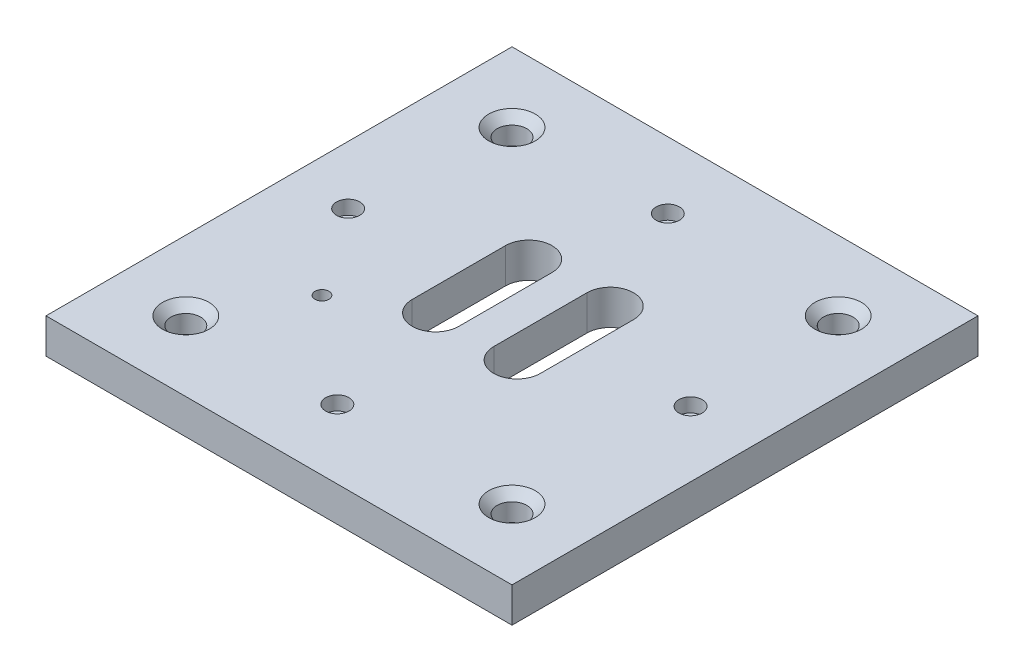
ISO-10303-21;
HEADER;
FILE_DESCRIPTION(('STEP AP214'),'2;1');
FILE_NAME('part.step','',(''),(''),'','','');
FILE_SCHEMA(('AUTOMOTIVE_DESIGN { 1 0 10303 214 1 1 1 1 }'));
ENDSEC;
DATA;
#1=APPLICATION_CONTEXT('core data for automotive mechanical design processes');
#2=APPLICATION_PROTOCOL_DEFINITION('international standard','automotive_design',2000,#1);
#3=PRODUCT_CONTEXT('',#1,'mechanical');
#4=PRODUCT('Part','Part','',(#3));
#5=PRODUCT_RELATED_PRODUCT_CATEGORY('part','',(#4));
#6=PRODUCT_DEFINITION_FORMATION('','',#4);
#7=PRODUCT_DEFINITION_CONTEXT('part definition',#1,'design');
#8=PRODUCT_DEFINITION('design','',#6,#7);
#9=PRODUCT_DEFINITION_SHAPE('','',#8);
#10=(LENGTH_UNIT() NAMED_UNIT(*) SI_UNIT(.MILLI.,.METRE.));
#11=(NAMED_UNIT(*) PLANE_ANGLE_UNIT() SI_UNIT($,.RADIAN.));
#12=(NAMED_UNIT(*) SI_UNIT($,.STERADIAN.) SOLID_ANGLE_UNIT());
#13=UNCERTAINTY_MEASURE_WITH_UNIT(LENGTH_MEASURE(1.E-05),#10,'distance_accuracy_value','');
#14=(GEOMETRIC_REPRESENTATION_CONTEXT(3) GLOBAL_UNCERTAINTY_ASSIGNED_CONTEXT((#13)) GLOBAL_UNIT_ASSIGNED_CONTEXT((#10,
#11,#12)) REPRESENTATION_CONTEXT('',''));
#15=CARTESIAN_POINT('',(0.,0.,0.));
#16=DIRECTION('',(0.,0.,1.));
#17=DIRECTION('',(1.,0.,0.));
#18=AXIS2_PLACEMENT_3D('',#15,#16,#17);
#19=CARTESIAN_POINT('',(200.,30.,200.));
#20=DIRECTION('',(-1.,0.,0.));
#21=DIRECTION('',(0.,0.,1.));
#22=AXIS2_PLACEMENT_3D('',#19,#20,#21);
#23=PLANE('',#22);
#24=DIRECTION('',(0.,0.,-1.));
#25=VECTOR('',#24,1.);
#26=CARTESIAN_POINT('',(200.,0.,200.));
#27=LINE('',#26,#25);
#28=CARTESIAN_POINT('',(200.,0.,200.));
#29=VERTEX_POINT('',#28);
#30=CARTESIAN_POINT('',(200.,0.,-200.));
#31=VERTEX_POINT('',#30);
#32=EDGE_CURVE('E295',#29,#31,#27,.T.);
#33=ORIENTED_EDGE('',*,*,#32,.T.);
#34=DIRECTION('',(0.,-1.,0.));
#35=VECTOR('',#34,1.);
#36=CARTESIAN_POINT('',(200.,30.,-200.));
#37=LINE('',#36,#35);
#38=CARTESIAN_POINT('',(200.,30.,-200.));
#39=VERTEX_POINT('',#38);
#40=EDGE_CURVE('E11',#39,#31,#37,.T.);
#41=ORIENTED_EDGE('',*,*,#40,.F.);
#42=DIRECTION('',(0.,0.,-1.));
#43=VECTOR('',#42,1.);
#44=CARTESIAN_POINT('',(200.,30.,200.));
#45=LINE('',#44,#43);
#46=CARTESIAN_POINT('',(200.,30.,200.));
#47=VERTEX_POINT('',#46);
#48=EDGE_CURVE('E296',#47,#39,#45,.T.);
#49=ORIENTED_EDGE('',*,*,#48,.F.);
#50=DIRECTION('',(0.,-1.,0.));
#51=VECTOR('',#50,1.);
#52=CARTESIAN_POINT('',(200.,30.,200.));
#53=LINE('',#52,#51);
#54=EDGE_CURVE('E306',#47,#29,#53,.T.);
#55=ORIENTED_EDGE('',*,*,#54,.T.);
#56=EDGE_LOOP('',(#33,#41,#49,#55));
#57=FACE_BOUND('',#56,.T.);
#58=ADVANCED_FACE('F35',(#57),#23,.F.);
#59=CARTESIAN_POINT('',(-200.,30.,-200.));
#60=DIRECTION('',(0.,0.,1.));
#61=DIRECTION('',(1.,0.,0.));
#62=AXIS2_PLACEMENT_3D('',#59,#60,#61);
#63=PLANE('',#62);
#64=DIRECTION('',(-1.,0.,0.));
#65=VECTOR('',#64,1.);
#66=CARTESIAN_POINT('',(-200.,0.,-200.));
#67=LINE('',#66,#65);
#68=CARTESIAN_POINT('',(-200.,0.,-200.));
#69=VERTEX_POINT('',#68);
#70=EDGE_CURVE('E309',#31,#69,#67,.T.);
#71=ORIENTED_EDGE('',*,*,#70,.T.);
#72=DIRECTION('',(0.,-1.,0.));
#73=VECTOR('',#72,1.);
#74=CARTESIAN_POINT('',(-200.,30.,-200.));
#75=LINE('',#74,#73);
#76=CARTESIAN_POINT('',(-200.,30.,-200.));
#77=VERTEX_POINT('',#76);
#78=EDGE_CURVE('E42',#77,#69,#75,.T.);
#79=ORIENTED_EDGE('',*,*,#78,.F.);
#80=DIRECTION('',(-1.,0.,0.));
#81=VECTOR('',#80,1.);
#82=CARTESIAN_POINT('',(-200.,30.,-200.));
#83=LINE('',#82,#81);
#84=EDGE_CURVE('E299',#39,#77,#83,.T.);
#85=ORIENTED_EDGE('',*,*,#84,.F.);
#86=ORIENTED_EDGE('',*,*,#40,.T.);
#87=EDGE_LOOP('',(#71,#79,#85,#86));
#88=FACE_BOUND('',#87,.T.);
#89=ADVANCED_FACE('F339',(#88),#63,.F.);
#90=CARTESIAN_POINT('',(-200.,30.,200.));
#91=DIRECTION('',(1.,0.,0.));
#92=DIRECTION('',(0.,0.,-1.));
#93=AXIS2_PLACEMENT_3D('',#90,#91,#92);
#94=PLANE('',#93);
#95=DIRECTION('',(0.,0.,1.));
#96=VECTOR('',#95,1.);
#97=CARTESIAN_POINT('',(-200.,0.,200.));
#98=LINE('',#97,#96);
#99=CARTESIAN_POINT('',(-200.,0.,200.));
#100=VERTEX_POINT('',#99);
#101=EDGE_CURVE('E311',#69,#100,#98,.T.);
#102=ORIENTED_EDGE('',*,*,#101,.T.);
#103=DIRECTION('',(0.,-1.,0.));
#104=VECTOR('',#103,1.);
#105=CARTESIAN_POINT('',(-200.,30.,200.));
#106=LINE('',#105,#104);
#107=CARTESIAN_POINT('',(-200.,30.,200.));
#108=VERTEX_POINT('',#107);
#109=EDGE_CURVE('E316',#108,#100,#106,.T.);
#110=ORIENTED_EDGE('',*,*,#109,.F.);
#111=DIRECTION('',(0.,0.,1.));
#112=VECTOR('',#111,1.);
#113=CARTESIAN_POINT('',(-200.,30.,200.));
#114=LINE('',#113,#112);
#115=EDGE_CURVE('E302',#77,#108,#114,.T.);
#116=ORIENTED_EDGE('',*,*,#115,.F.);
#117=ORIENTED_EDGE('',*,*,#78,.T.);
#118=EDGE_LOOP('',(#102,#110,#116,#117));
#119=FACE_BOUND('',#118,.T.);
#120=ADVANCED_FACE('F323',(#119),#94,.F.);
#121=CARTESIAN_POINT('',(-200.,30.,200.));
#122=DIRECTION('',(0.,0.,-1.));
#123=DIRECTION('',(-1.,0.,0.));
#124=AXIS2_PLACEMENT_3D('',#121,#122,#123);
#125=PLANE('',#124);
#126=DIRECTION('',(1.,0.,0.));
#127=VECTOR('',#126,1.);
#128=CARTESIAN_POINT('',(-200.,0.,200.));
#129=LINE('',#128,#127);
#130=EDGE_CURVE('E300',#100,#29,#129,.T.);
#131=ORIENTED_EDGE('',*,*,#130,.T.);
#132=ORIENTED_EDGE('',*,*,#54,.F.);
#133=DIRECTION('',(1.,0.,0.));
#134=VECTOR('',#133,1.);
#135=CARTESIAN_POINT('',(-200.,30.,200.));
#136=LINE('',#135,#134);
#137=EDGE_CURVE('E304',#108,#47,#136,.T.);
#138=ORIENTED_EDGE('',*,*,#137,.F.);
#139=ORIENTED_EDGE('',*,*,#109,.T.);
#140=EDGE_LOOP('',(#131,#132,#138,#139));
#141=FACE_BOUND('',#140,.T.);
#142=ADVANCED_FACE('F332',(#141),#125,.F.);
#143=CARTESIAN_POINT('',(0.,30.,0.));
#144=DIRECTION('',(0.,-1.,0.));
#145=DIRECTION('',(0.,0.,-1.));
#146=AXIS2_PLACEMENT_3D('',#143,#144,#145);
#147=PLANE('',#146);
#148=CARTESIAN_POINT('',(-96.8218511033105,30.,66.2899605565278));
#149=DIRECTION('',(0.,1.,0.));
#150=DIRECTION('',(0.,0.,1.));
#151=AXIS2_PLACEMENT_3D('',#148,#149,#150);
#152=CIRCLE('',#151,5.99999999999999);
#153=CARTESIAN_POINT('',(-96.8218511033105,30.,72.2899605565278));
#154=VERTEX_POINT('',#153);
#155=EDGE_CURVE('E135',#154,#154,#152,.T.);
#156=ORIENTED_EDGE('',*,*,#155,.F.);
#157=EDGE_LOOP('',(#156));
#158=FACE_BOUND('',#157,.T.);
#159=CARTESIAN_POINT('',(-9.13597394705512,30.,140.778837954315));
#160=DIRECTION('',(0.,1.,0.));
#161=DIRECTION('',(0.,0.,1.));
#162=AXIS2_PLACEMENT_3D('',#159,#160,#161);
#163=CIRCLE('',#162,10.);
#164=CARTESIAN_POINT('',(-9.13597394705512,30.,150.778837954315));
#165=VERTEX_POINT('',#164);
#166=EDGE_CURVE('E134',#165,#165,#163,.T.);
#167=ORIENTED_EDGE('',*,*,#166,.F.);
#168=EDGE_LOOP('',(#167));
#169=FACE_BOUND('',#168,.T.);
#170=CARTESIAN_POINT('',(-149.993262569964,30.,-9.35211061793355));
#171=DIRECTION('',(0.,1.,0.));
#172=DIRECTION('',(0.,0.,1.));
#173=AXIS2_PLACEMENT_3D('',#170,#171,#172);
#174=CIRCLE('',#173,10.);
#175=CARTESIAN_POINT('',(-149.993262569964,30.,0.647889382066454));
#176=VERTEX_POINT('',#175);
#177=EDGE_CURVE('E151',#176,#176,#174,.T.);
#178=ORIENTED_EDGE('',*,*,#177,.F.);
#179=EDGE_LOOP('',(#178));
#180=FACE_BOUND('',#179,.T.);
#181=CARTESIAN_POINT('',(-9.13597394705512,30.,-142.861352041251));
#182=DIRECTION('',(0.,1.,0.));
#183=DIRECTION('',(0.,0.,1.));
#184=AXIS2_PLACEMENT_3D('',#181,#182,#183);
#185=CIRCLE('',#184,10.);
#186=CARTESIAN_POINT('',(-9.13597394705512,30.,-132.861352041251));
#187=VERTEX_POINT('',#186);
#188=EDGE_CURVE('E163',#187,#187,#185,.T.);
#189=ORIENTED_EDGE('',*,*,#188,.F.);
#190=EDGE_LOOP('',(#189));
#191=FACE_BOUND('',#190,.T.);
#192=CARTESIAN_POINT('',(143.896335676409,30.,-9.35211061793355));
#193=DIRECTION('',(0.,1.,0.));
#194=DIRECTION('',(0.,0.,1.));
#195=AXIS2_PLACEMENT_3D('',#192,#193,#194);
#196=CIRCLE('',#195,10.);
#197=CARTESIAN_POINT('',(143.896335676409,30.,0.647889382066454));
#198=VERTEX_POINT('',#197);
#199=EDGE_CURVE('E175',#198,#198,#196,.T.);
#200=ORIENTED_EDGE('',*,*,#199,.F.);
#201=EDGE_LOOP('',(#200));
#202=FACE_BOUND('',#201,.T.);
#203=CARTESIAN_POINT('',(-35.,30.,30.6478893820665));
#204=DIRECTION('',(0.,1.,0.));
#205=DIRECTION('',(0.,0.,1.));
#206=AXIS2_PLACEMENT_3D('',#203,#204,#205);
#207=CIRCLE('',#206,20.);
#208=CARTESIAN_POINT('',(-55.,30.,30.6478893820665));
#209=VERTEX_POINT('',#208);
#210=CARTESIAN_POINT('',(-15.,30.,30.6478893820665));
#211=VERTEX_POINT('',#210);
#212=EDGE_CURVE('E202',#209,#211,#207,.T.);
#213=ORIENTED_EDGE('',*,*,#212,.F.);
#214=DIRECTION('',(0.,0.,1.));
#215=VECTOR('',#214,1.);
#216=CARTESIAN_POINT('',(-55.,30.,0.));
#217=LINE('',#216,#215);
#218=CARTESIAN_POINT('',(-55.,30.,-49.3521106179335));
#219=VERTEX_POINT('',#218);
#220=EDGE_CURVE('E49',#219,#209,#217,.T.);
#221=ORIENTED_EDGE('',*,*,#220,.F.);
#222=CARTESIAN_POINT('',(-35.,30.,-49.3521106179335));
#223=DIRECTION('',(0.,1.,0.));
#224=DIRECTION('',(0.,0.,1.));
#225=AXIS2_PLACEMENT_3D('',#222,#223,#224);
#226=CIRCLE('',#225,20.);
#227=CARTESIAN_POINT('',(-15.,30.,-49.3521106179335));
#228=VERTEX_POINT('',#227);
#229=EDGE_CURVE('E191',#228,#219,#226,.T.);
#230=ORIENTED_EDGE('',*,*,#229,.F.);
#231=DIRECTION('',(0.,0.,1.));
#232=VECTOR('',#231,1.);
#233=CARTESIAN_POINT('',(-15.,30.,0.));
#234=LINE('',#233,#232);
#235=EDGE_CURVE('E206',#228,#211,#234,.T.);
#236=ORIENTED_EDGE('',*,*,#235,.T.);
#237=EDGE_LOOP('',(#213,#221,#230,#236));
#238=FACE_BOUND('',#237,.T.);
#239=CARTESIAN_POINT('',(35.,30.,30.6478893820665));
#240=DIRECTION('',(0.,1.,0.));
#241=DIRECTION('',(0.,0.,1.));
#242=AXIS2_PLACEMENT_3D('',#239,#240,#241);
#243=CIRCLE('',#242,20.);
#244=CARTESIAN_POINT('',(15.,30.,30.6478893820665));
#245=VERTEX_POINT('',#244);
#246=CARTESIAN_POINT('',(55.,30.,30.6478893820664));
#247=VERTEX_POINT('',#246);
#248=EDGE_CURVE('E234',#245,#247,#243,.T.);
#249=ORIENTED_EDGE('',*,*,#248,.F.);
#250=DIRECTION('',(0.,0.,1.));
#251=VECTOR('',#250,1.);
#252=CARTESIAN_POINT('',(15.,30.,0.));
#253=LINE('',#252,#251);
#254=CARTESIAN_POINT('',(15.,30.,-49.3521106179335));
#255=VERTEX_POINT('',#254);
#256=EDGE_CURVE('E57',#255,#245,#253,.T.);
#257=ORIENTED_EDGE('',*,*,#256,.F.);
#258=CARTESIAN_POINT('',(35.,30.,-49.3521106179335));
#259=DIRECTION('',(0.,1.,0.));
#260=DIRECTION('',(0.,0.,1.));
#261=AXIS2_PLACEMENT_3D('',#258,#259,#260);
#262=CIRCLE('',#261,20.);
#263=CARTESIAN_POINT('',(54.9999999999999,30.,-49.3521106179336));
#264=VERTEX_POINT('',#263);
#265=EDGE_CURVE('E223',#264,#255,#262,.T.);
#266=ORIENTED_EDGE('',*,*,#265,.F.);
#267=DIRECTION('',(0.,0.,1.));
#268=VECTOR('',#267,1.);
#269=CARTESIAN_POINT('',(55.,30.,0.));
#270=LINE('',#269,#268);
#271=EDGE_CURVE('E237',#264,#247,#270,.T.);
#272=ORIENTED_EDGE('',*,*,#271,.T.);
#273=EDGE_LOOP('',(#249,#257,#266,#272));
#274=FACE_BOUND('',#273,.T.);
#275=CARTESIAN_POINT('',(-140.,30.,140.));
#276=DIRECTION('',(0.,1.,0.));
#277=DIRECTION('',(0.,0.,1.));
#278=AXIS2_PLACEMENT_3D('',#275,#276,#277);
#279=CIRCLE('',#278,20.);
#280=CARTESIAN_POINT('',(-140.,30.,160.));
#281=VERTEX_POINT('',#280);
#282=EDGE_CURVE('E250',#281,#281,#279,.T.);
#283=ORIENTED_EDGE('',*,*,#282,.F.);
#284=EDGE_LOOP('',(#283));
#285=FACE_BOUND('',#284,.T.);
#286=CARTESIAN_POINT('',(-140.,30.,-140.));
#287=DIRECTION('',(0.,1.,0.));
#288=DIRECTION('',(0.,0.,1.));
#289=AXIS2_PLACEMENT_3D('',#286,#287,#288);
#290=CIRCLE('',#289,20.);
#291=CARTESIAN_POINT('',(-140.,30.,-120.));
#292=VERTEX_POINT('',#291);
#293=EDGE_CURVE('E262',#292,#292,#290,.T.);
#294=ORIENTED_EDGE('',*,*,#293,.F.);
#295=EDGE_LOOP('',(#294));
#296=FACE_BOUND('',#295,.T.);
#297=CARTESIAN_POINT('',(140.,30.,140.));
#298=DIRECTION('',(0.,1.,0.));
#299=DIRECTION('',(0.,0.,1.));
#300=AXIS2_PLACEMENT_3D('',#297,#298,#299);
#301=CIRCLE('',#300,20.);
#302=CARTESIAN_POINT('',(140.,30.,160.));
#303=VERTEX_POINT('',#302);
#304=EDGE_CURVE('E274',#303,#303,#301,.T.);
#305=ORIENTED_EDGE('',*,*,#304,.F.);
#306=EDGE_LOOP('',(#305));
#307=FACE_BOUND('',#306,.T.);
#308=CARTESIAN_POINT('',(140.,30.,-140.));
#309=DIRECTION('',(0.,1.,0.));
#310=DIRECTION('',(0.,0.,1.));
#311=AXIS2_PLACEMENT_3D('',#308,#309,#310);
#312=CIRCLE('',#311,20.);
#313=CARTESIAN_POINT('',(140.,30.,-120.));
#314=VERTEX_POINT('',#313);
#315=EDGE_CURVE('E286',#314,#314,#312,.T.);
#316=ORIENTED_EDGE('',*,*,#315,.F.);
#317=EDGE_LOOP('',(#316));
#318=FACE_BOUND('',#317,.T.);
#319=ORIENTED_EDGE('',*,*,#48,.T.);
#320=ORIENTED_EDGE('',*,*,#84,.T.);
#321=ORIENTED_EDGE('',*,*,#115,.T.);
#322=ORIENTED_EDGE('',*,*,#137,.T.);
#323=EDGE_LOOP('',(#319,#320,#321,#322));
#324=FACE_BOUND('',#323,.T.);
#325=ADVANCED_FACE('F338',(#158,#169,#180,#191,#202,#238,#274,#285,#296,#307,#318,#324),#147,.F.);
#326=CARTESIAN_POINT('',(0.,0.,0.));
#327=DIRECTION('',(0.,-1.,0.));
#328=DIRECTION('',(0.,0.,-1.));
#329=AXIS2_PLACEMENT_3D('',#326,#327,#328);
#330=PLANE('',#329);
#331=CARTESIAN_POINT('',(-9.13597394705512,0.,140.778837954315));
#332=DIRECTION('',(0.,1.,0.));
#333=DIRECTION('',(0.,0.,1.));
#334=AXIS2_PLACEMENT_3D('',#331,#332,#333);
#335=CIRCLE('',#334,6.49999999999999);
#336=CARTESIAN_POINT('',(-9.13597394705512,0.,147.278837954315));
#337=VERTEX_POINT('',#336);
#338=EDGE_CURVE('E148',#337,#337,#335,.T.);
#339=ORIENTED_EDGE('',*,*,#338,.T.);
#340=EDGE_LOOP('',(#339));
#341=FACE_BOUND('',#340,.T.);
#342=CARTESIAN_POINT('',(-149.993262569964,0.,-9.35211061793355));
#343=DIRECTION('',(0.,1.,0.));
#344=DIRECTION('',(0.,0.,1.));
#345=AXIS2_PLACEMENT_3D('',#342,#343,#344);
#346=CIRCLE('',#345,6.50000000000001);
#347=CARTESIAN_POINT('',(-149.993262569964,0.,-2.85211061793355));
#348=VERTEX_POINT('',#347);
#349=EDGE_CURVE('E160',#348,#348,#346,.T.);
#350=ORIENTED_EDGE('',*,*,#349,.T.);
#351=EDGE_LOOP('',(#350));
#352=FACE_BOUND('',#351,.T.);
#353=CARTESIAN_POINT('',(-9.13597394705512,0.,-142.861352041251));
#354=DIRECTION('',(0.,1.,0.));
#355=DIRECTION('',(0.,0.,1.));
#356=AXIS2_PLACEMENT_3D('',#353,#354,#355);
#357=CIRCLE('',#356,6.49999999999999);
#358=CARTESIAN_POINT('',(-9.13597394705512,0.,-136.361352041251));
#359=VERTEX_POINT('',#358);
#360=EDGE_CURVE('E172',#359,#359,#357,.T.);
#361=ORIENTED_EDGE('',*,*,#360,.T.);
#362=EDGE_LOOP('',(#361));
#363=FACE_BOUND('',#362,.T.);
#364=CARTESIAN_POINT('',(143.896335676409,0.,-9.35211061793355));
#365=DIRECTION('',(0.,1.,0.));
#366=DIRECTION('',(0.,0.,1.));
#367=AXIS2_PLACEMENT_3D('',#364,#365,#366);
#368=CIRCLE('',#367,6.50000000000001);
#369=CARTESIAN_POINT('',(143.896335676409,0.,-2.85211061793355));
#370=VERTEX_POINT('',#369);
#371=EDGE_CURVE('E184',#370,#370,#368,.T.);
#372=ORIENTED_EDGE('',*,*,#371,.T.);
#373=EDGE_LOOP('',(#372));
#374=FACE_BOUND('',#373,.T.);
#375=DIRECTION('',(0.,0.,1.));
#376=VECTOR('',#375,1.);
#377=CARTESIAN_POINT('',(-55.,0.,0.));
#378=LINE('',#377,#376);
#379=CARTESIAN_POINT('',(-55.,0.,-49.3521106179335));
#380=VERTEX_POINT('',#379);
#381=CARTESIAN_POINT('',(-55.,0.,30.6478893820665));
#382=VERTEX_POINT('',#381);
#383=EDGE_CURVE('E187',#380,#382,#378,.T.);
#384=ORIENTED_EDGE('',*,*,#383,.T.);
#385=CARTESIAN_POINT('',(-35.,0.,30.6478893820665));
#386=DIRECTION('',(0.,1.,0.));
#387=DIRECTION('',(0.,0.,1.));
#388=AXIS2_PLACEMENT_3D('',#385,#386,#387);
#389=CIRCLE('',#388,20.);
#390=CARTESIAN_POINT('',(-15.,0.,30.6478893820665));
#391=VERTEX_POINT('',#390);
#392=EDGE_CURVE('E190',#382,#391,#389,.T.);
#393=ORIENTED_EDGE('',*,*,#392,.T.);
#394=DIRECTION('',(0.,0.,1.));
#395=VECTOR('',#394,1.);
#396=CARTESIAN_POINT('',(-15.,0.,0.));
#397=LINE('',#396,#395);
#398=CARTESIAN_POINT('',(-15.,0.,-49.3521106179335));
#399=VERTEX_POINT('',#398);
#400=EDGE_CURVE('E194',#399,#391,#397,.T.);
#401=ORIENTED_EDGE('',*,*,#400,.F.);
#402=CARTESIAN_POINT('',(-35.,0.,-49.3521106179335));
#403=DIRECTION('',(0.,1.,0.));
#404=DIRECTION('',(0.,0.,1.));
#405=AXIS2_PLACEMENT_3D('',#402,#403,#404);
#406=CIRCLE('',#405,20.);
#407=EDGE_CURVE('E197',#399,#380,#406,.T.);
#408=ORIENTED_EDGE('',*,*,#407,.T.);
#409=EDGE_LOOP('',(#384,#393,#401,#408));
#410=FACE_BOUND('',#409,.T.);
#411=DIRECTION('',(0.,0.,1.));
#412=VECTOR('',#411,1.);
#413=CARTESIAN_POINT('',(15.,0.,0.));
#414=LINE('',#413,#412);
#415=CARTESIAN_POINT('',(15.,0.,-49.3521106179335));
#416=VERTEX_POINT('',#415);
#417=CARTESIAN_POINT('',(15.,0.,30.6478893820665));
#418=VERTEX_POINT('',#417);
#419=EDGE_CURVE('E219',#416,#418,#414,.T.);
#420=ORIENTED_EDGE('',*,*,#419,.T.);
#421=CARTESIAN_POINT('',(35.,0.,30.6478893820665));
#422=DIRECTION('',(0.,1.,0.));
#423=DIRECTION('',(0.,0.,1.));
#424=AXIS2_PLACEMENT_3D('',#421,#422,#423);
#425=CIRCLE('',#424,20.);
#426=CARTESIAN_POINT('',(55.,0.,30.6478893820664));
#427=VERTEX_POINT('',#426);
#428=EDGE_CURVE('E222',#418,#427,#425,.T.);
#429=ORIENTED_EDGE('',*,*,#428,.T.);
#430=DIRECTION('',(0.,0.,1.));
#431=VECTOR('',#430,1.);
#432=CARTESIAN_POINT('',(55.,0.,0.));
#433=LINE('',#432,#431);
#434=CARTESIAN_POINT('',(54.9999999999999,0.,-49.3521106179336));
#435=VERTEX_POINT('',#434);
#436=EDGE_CURVE('E226',#435,#427,#433,.T.);
#437=ORIENTED_EDGE('',*,*,#436,.F.);
#438=CARTESIAN_POINT('',(35.,0.,-49.3521106179335));
#439=DIRECTION('',(0.,1.,0.));
#440=DIRECTION('',(0.,0.,1.));
#441=AXIS2_PLACEMENT_3D('',#438,#439,#440);
#442=CIRCLE('',#441,20.);
#443=EDGE_CURVE('E229',#435,#416,#442,.T.);
#444=ORIENTED_EDGE('',*,*,#443,.T.);
#445=EDGE_LOOP('',(#420,#429,#437,#444));
#446=FACE_BOUND('',#445,.T.);
#447=CARTESIAN_POINT('',(-140.,0.,140.));
#448=DIRECTION('',(0.,1.,0.));
#449=DIRECTION('',(0.,0.,1.));
#450=AXIS2_PLACEMENT_3D('',#447,#448,#449);
#451=CIRCLE('',#450,20.);
#452=CARTESIAN_POINT('',(-140.,0.,160.));
#453=VERTEX_POINT('',#452);
#454=EDGE_CURVE('E213',#453,#453,#451,.T.);
#455=ORIENTED_EDGE('',*,*,#454,.T.);
#456=EDGE_LOOP('',(#455));
#457=FACE_BOUND('',#456,.T.);
#458=CARTESIAN_POINT('',(-140.,0.,-140.));
#459=DIRECTION('',(0.,1.,0.));
#460=DIRECTION('',(0.,0.,1.));
#461=AXIS2_PLACEMENT_3D('',#458,#459,#460);
#462=CIRCLE('',#461,20.);
#463=CARTESIAN_POINT('',(-140.,0.,-120.));
#464=VERTEX_POINT('',#463);
#465=EDGE_CURVE('E259',#464,#464,#462,.T.);
#466=ORIENTED_EDGE('',*,*,#465,.T.);
#467=EDGE_LOOP('',(#466));
#468=FACE_BOUND('',#467,.T.);
#469=CARTESIAN_POINT('',(140.,0.,140.));
#470=DIRECTION('',(0.,1.,0.));
#471=DIRECTION('',(0.,0.,1.));
#472=AXIS2_PLACEMENT_3D('',#469,#470,#471);
#473=CIRCLE('',#472,20.);
#474=CARTESIAN_POINT('',(140.,0.,160.));
#475=VERTEX_POINT('',#474);
#476=EDGE_CURVE('E271',#475,#475,#473,.T.);
#477=ORIENTED_EDGE('',*,*,#476,.T.);
#478=EDGE_LOOP('',(#477));
#479=FACE_BOUND('',#478,.T.);
#480=CARTESIAN_POINT('',(140.,0.,-140.));
#481=DIRECTION('',(0.,1.,0.));
#482=DIRECTION('',(0.,0.,1.));
#483=AXIS2_PLACEMENT_3D('',#480,#481,#482);
#484=CIRCLE('',#483,20.);
#485=CARTESIAN_POINT('',(140.,0.,-120.));
#486=VERTEX_POINT('',#485);
#487=EDGE_CURVE('E283',#486,#486,#484,.T.);
#488=ORIENTED_EDGE('',*,*,#487,.T.);
#489=EDGE_LOOP('',(#488));
#490=FACE_BOUND('',#489,.T.);
#491=ORIENTED_EDGE('',*,*,#32,.F.);
#492=ORIENTED_EDGE('',*,*,#130,.F.);
#493=ORIENTED_EDGE('',*,*,#101,.F.);
#494=ORIENTED_EDGE('',*,*,#70,.F.);
#495=EDGE_LOOP('',(#491,#492,#493,#494));
#496=FACE_BOUND('',#495,.T.);
#497=ADVANCED_FACE('F329',(#341,#352,#363,#374,#410,#446,#457,#468,#479,#490,#496),#330,.T.);
#498=CARTESIAN_POINT('',(140.,7.25,-140.));
#499=DIRECTION('',(0.,-1.,0.));
#500=DIRECTION('',(0.,0.,-1.));
#501=AXIS2_PLACEMENT_3D('',#498,#499,#500);
#502=CONICAL_SURFACE('',#501,12.75,0.785398163397447);
#503=ORIENTED_EDGE('',*,*,#487,.F.);
#504=EDGE_LOOP('',(#503));
#505=FACE_BOUND('',#504,.T.);
#506=CARTESIAN_POINT('',(140.,7.25,-140.));
#507=DIRECTION('',(0.,1.,0.));
#508=DIRECTION('',(0.,0.,1.));
#509=AXIS2_PLACEMENT_3D('',#506,#507,#508);
#510=CIRCLE('',#509,12.75);
#511=CARTESIAN_POINT('',(140.,7.25,-127.25));
#512=VERTEX_POINT('',#511);
#513=EDGE_CURVE('E292',#512,#512,#510,.T.);
#514=ORIENTED_EDGE('',*,*,#513,.T.);
#515=EDGE_LOOP('',(#514));
#516=FACE_BOUND('',#515,.T.);
#517=ADVANCED_FACE('F351',(#505,#516),#502,.F.);
#518=CARTESIAN_POINT('',(140.,30.,-140.));
#519=DIRECTION('',(0.,1.,0.));
#520=DIRECTION('',(0.,0.,1.));
#521=AXIS2_PLACEMENT_3D('',#518,#519,#520);
#522=CYLINDRICAL_SURFACE('',#521,12.75);
#523=ORIENTED_EDGE('',*,*,#513,.F.);
#524=EDGE_LOOP('',(#523));
#525=FACE_BOUND('',#524,.T.);
#526=CARTESIAN_POINT('',(140.,22.75,-140.));
#527=DIRECTION('',(0.,1.,0.));
#528=DIRECTION('',(0.,0.,1.));
#529=AXIS2_PLACEMENT_3D('',#526,#527,#528);
#530=CIRCLE('',#529,12.75);
#531=CARTESIAN_POINT('',(140.,22.75,-127.25));
#532=VERTEX_POINT('',#531);
#533=EDGE_CURVE('E289',#532,#532,#530,.T.);
#534=ORIENTED_EDGE('',*,*,#533,.T.);
#535=EDGE_LOOP('',(#534));
#536=FACE_BOUND('',#535,.T.);
#537=ADVANCED_FACE('F358',(#525,#536),#522,.F.);
#538=CARTESIAN_POINT('',(140.,30.,-140.));
#539=DIRECTION('',(0.,1.,0.));
#540=DIRECTION('',(0.,0.,1.));
#541=AXIS2_PLACEMENT_3D('',#538,#539,#540);
#542=CONICAL_SURFACE('',#541,20.,0.785398163397447);
#543=ORIENTED_EDGE('',*,*,#533,.F.);
#544=EDGE_LOOP('',(#543));
#545=FACE_BOUND('',#544,.T.);
#546=ORIENTED_EDGE('',*,*,#315,.T.);
#547=EDGE_LOOP('',(#546));
#548=FACE_BOUND('',#547,.T.);
#549=ADVANCED_FACE('F362',(#545,#548),#542,.F.);
#550=CARTESIAN_POINT('',(140.,7.25,140.));
#551=DIRECTION('',(0.,-1.,0.));
#552=DIRECTION('',(0.,0.,-1.));
#553=AXIS2_PLACEMENT_3D('',#550,#551,#552);
#554=CONICAL_SURFACE('',#553,12.75,0.785398163397447);
#555=ORIENTED_EDGE('',*,*,#476,.F.);
#556=EDGE_LOOP('',(#555));
#557=FACE_BOUND('',#556,.T.);
#558=CARTESIAN_POINT('',(140.,7.25,140.));
#559=DIRECTION('',(0.,1.,0.));
#560=DIRECTION('',(0.,0.,1.));
#561=AXIS2_PLACEMENT_3D('',#558,#559,#560);
#562=CIRCLE('',#561,12.75);
#563=CARTESIAN_POINT('',(140.,7.25,152.75));
#564=VERTEX_POINT('',#563);
#565=EDGE_CURVE('E280',#564,#564,#562,.T.);
#566=ORIENTED_EDGE('',*,*,#565,.T.);
#567=EDGE_LOOP('',(#566));
#568=FACE_BOUND('',#567,.T.);
#569=ADVANCED_FACE('F366',(#557,#568),#554,.F.);
#570=CARTESIAN_POINT('',(140.,30.,140.));
#571=DIRECTION('',(0.,1.,0.));
#572=DIRECTION('',(0.,0.,1.));
#573=AXIS2_PLACEMENT_3D('',#570,#571,#572);
#574=CYLINDRICAL_SURFACE('',#573,12.75);
#575=ORIENTED_EDGE('',*,*,#565,.F.);
#576=EDGE_LOOP('',(#575));
#577=FACE_BOUND('',#576,.T.);
#578=CARTESIAN_POINT('',(140.,22.75,140.));
#579=DIRECTION('',(0.,1.,0.));
#580=DIRECTION('',(0.,0.,1.));
#581=AXIS2_PLACEMENT_3D('',#578,#579,#580);
#582=CIRCLE('',#581,12.75);
#583=CARTESIAN_POINT('',(140.,22.75,152.75));
#584=VERTEX_POINT('',#583);
#585=EDGE_CURVE('E277',#584,#584,#582,.T.);
#586=ORIENTED_EDGE('',*,*,#585,.T.);
#587=EDGE_LOOP('',(#586));
#588=FACE_BOUND('',#587,.T.);
#589=ADVANCED_FACE('F370',(#577,#588),#574,.F.);
#590=CARTESIAN_POINT('',(140.,30.,140.));
#591=DIRECTION('',(0.,1.,0.));
#592=DIRECTION('',(0.,0.,1.));
#593=AXIS2_PLACEMENT_3D('',#590,#591,#592);
#594=CONICAL_SURFACE('',#593,20.,0.785398163397447);
#595=ORIENTED_EDGE('',*,*,#585,.F.);
#596=EDGE_LOOP('',(#595));
#597=FACE_BOUND('',#596,.T.);
#598=ORIENTED_EDGE('',*,*,#304,.T.);
#599=EDGE_LOOP('',(#598));
#600=FACE_BOUND('',#599,.T.);
#601=ADVANCED_FACE('F374',(#597,#600),#594,.F.);
#602=CARTESIAN_POINT('',(-140.,7.25,-140.));
#603=DIRECTION('',(0.,-1.,0.));
#604=DIRECTION('',(0.,0.,-1.));
#605=AXIS2_PLACEMENT_3D('',#602,#603,#604);
#606=CONICAL_SURFACE('',#605,12.75,0.785398163397448);
#607=ORIENTED_EDGE('',*,*,#465,.F.);
#608=EDGE_LOOP('',(#607));
#609=FACE_BOUND('',#608,.T.);
#610=CARTESIAN_POINT('',(-140.,7.25,-140.));
#611=DIRECTION('',(0.,1.,0.));
#612=DIRECTION('',(0.,0.,1.));
#613=AXIS2_PLACEMENT_3D('',#610,#611,#612);
#614=CIRCLE('',#613,12.75);
#615=CARTESIAN_POINT('',(-140.,7.25,-127.25));
#616=VERTEX_POINT('',#615);
#617=EDGE_CURVE('E268',#616,#616,#614,.T.);
#618=ORIENTED_EDGE('',*,*,#617,.T.);
#619=EDGE_LOOP('',(#618));
#620=FACE_BOUND('',#619,.T.);
#621=ADVANCED_FACE('F378',(#609,#620),#606,.F.);
#622=CARTESIAN_POINT('',(-140.,30.,-140.));
#623=DIRECTION('',(0.,1.,0.));
#624=DIRECTION('',(0.,0.,1.));
#625=AXIS2_PLACEMENT_3D('',#622,#623,#624);
#626=CYLINDRICAL_SURFACE('',#625,12.75);
#627=ORIENTED_EDGE('',*,*,#617,.F.);
#628=EDGE_LOOP('',(#627));
#629=FACE_BOUND('',#628,.T.);
#630=CARTESIAN_POINT('',(-140.,22.75,-140.));
#631=DIRECTION('',(0.,1.,0.));
#632=DIRECTION('',(0.,0.,1.));
#633=AXIS2_PLACEMENT_3D('',#630,#631,#632);
#634=CIRCLE('',#633,12.75);
#635=CARTESIAN_POINT('',(-140.,22.75,-127.25));
#636=VERTEX_POINT('',#635);
#637=EDGE_CURVE('E265',#636,#636,#634,.T.);
#638=ORIENTED_EDGE('',*,*,#637,.T.);
#639=EDGE_LOOP('',(#638));
#640=FACE_BOUND('',#639,.T.);
#641=ADVANCED_FACE('F382',(#629,#640),#626,.F.);
#642=CARTESIAN_POINT('',(-140.,30.,-140.));
#643=DIRECTION('',(0.,1.,0.));
#644=DIRECTION('',(0.,0.,1.));
#645=AXIS2_PLACEMENT_3D('',#642,#643,#644);
#646=CONICAL_SURFACE('',#645,20.,0.785398163397448);
#647=ORIENTED_EDGE('',*,*,#637,.F.);
#648=EDGE_LOOP('',(#647));
#649=FACE_BOUND('',#648,.T.);
#650=ORIENTED_EDGE('',*,*,#293,.T.);
#651=EDGE_LOOP('',(#650));
#652=FACE_BOUND('',#651,.T.);
#653=ADVANCED_FACE('F386',(#649,#652),#646,.F.);
#654=CARTESIAN_POINT('',(-140.,7.25,140.));
#655=DIRECTION('',(0.,-1.,0.));
#656=DIRECTION('',(0.,0.,-1.));
#657=AXIS2_PLACEMENT_3D('',#654,#655,#656);
#658=CONICAL_SURFACE('',#657,12.75,0.785398163397448);
#659=ORIENTED_EDGE('',*,*,#454,.F.);
#660=EDGE_LOOP('',(#659));
#661=FACE_BOUND('',#660,.T.);
#662=CARTESIAN_POINT('',(-140.,7.25,140.));
#663=DIRECTION('',(0.,1.,0.));
#664=DIRECTION('',(0.,0.,1.));
#665=AXIS2_PLACEMENT_3D('',#662,#663,#664);
#666=CIRCLE('',#665,12.75);
#667=CARTESIAN_POINT('',(-140.,7.25,152.75));
#668=VERTEX_POINT('',#667);
#669=EDGE_CURVE('E256',#668,#668,#666,.T.);
#670=ORIENTED_EDGE('',*,*,#669,.T.);
#671=EDGE_LOOP('',(#670));
#672=FACE_BOUND('',#671,.T.);
#673=ADVANCED_FACE('F390',(#661,#672),#658,.F.);
#674=CARTESIAN_POINT('',(-140.,30.,140.));
#675=DIRECTION('',(0.,1.,0.));
#676=DIRECTION('',(0.,0.,1.));
#677=AXIS2_PLACEMENT_3D('',#674,#675,#676);
#678=CYLINDRICAL_SURFACE('',#677,12.75);
#679=ORIENTED_EDGE('',*,*,#669,.F.);
#680=EDGE_LOOP('',(#679));
#681=FACE_BOUND('',#680,.T.);
#682=CARTESIAN_POINT('',(-140.,22.75,140.));
#683=DIRECTION('',(0.,1.,0.));
#684=DIRECTION('',(0.,0.,1.));
#685=AXIS2_PLACEMENT_3D('',#682,#683,#684);
#686=CIRCLE('',#685,12.75);
#687=CARTESIAN_POINT('',(-140.,22.75,152.75));
#688=VERTEX_POINT('',#687);
#689=EDGE_CURVE('E253',#688,#688,#686,.T.);
#690=ORIENTED_EDGE('',*,*,#689,.T.);
#691=EDGE_LOOP('',(#690));
#692=FACE_BOUND('',#691,.T.);
#693=ADVANCED_FACE('F394',(#681,#692),#678,.F.);
#694=CARTESIAN_POINT('',(-140.,30.,140.));
#695=DIRECTION('',(0.,1.,0.));
#696=DIRECTION('',(0.,0.,1.));
#697=AXIS2_PLACEMENT_3D('',#694,#695,#696);
#698=CONICAL_SURFACE('',#697,20.,0.785398163397448);
#699=ORIENTED_EDGE('',*,*,#689,.F.);
#700=EDGE_LOOP('',(#699));
#701=FACE_BOUND('',#700,.T.);
#702=ORIENTED_EDGE('',*,*,#282,.T.);
#703=EDGE_LOOP('',(#702));
#704=FACE_BOUND('',#703,.T.);
#705=ADVANCED_FACE('F398',(#701,#704),#698,.F.);
#706=CARTESIAN_POINT('',(15.,0.,0.));
#707=DIRECTION('',(-1.,0.,0.));
#708=DIRECTION('',(0.,0.,1.));
#709=AXIS2_PLACEMENT_3D('',#706,#707,#708);
#710=PLANE('',#709);
#711=ORIENTED_EDGE('',*,*,#256,.T.);
#712=DIRECTION('',(0.,1.,0.));
#713=VECTOR('',#712,1.);
#714=CARTESIAN_POINT('',(15.,0.,30.6478893820665));
#715=LINE('',#714,#713);
#716=EDGE_CURVE('E232',#418,#245,#715,.T.);
#717=ORIENTED_EDGE('',*,*,#716,.F.);
#718=ORIENTED_EDGE('',*,*,#419,.F.);
#719=DIRECTION('',(0.,1.,0.));
#720=VECTOR('',#719,1.);
#721=CARTESIAN_POINT('',(15.,0.,-49.3521106179335));
#722=LINE('',#721,#720);
#723=EDGE_CURVE('E203',#416,#255,#722,.T.);
#724=ORIENTED_EDGE('',*,*,#723,.T.);
#725=EDGE_LOOP('',(#711,#717,#718,#724));
#726=FACE_BOUND('',#725,.T.);
#727=ADVANCED_FACE('F402',(#726),#710,.F.);
#728=CARTESIAN_POINT('',(35.,0.,-49.3521106179335));
#729=DIRECTION('',(0.,1.,0.));
#730=DIRECTION('',(0.,0.,1.));
#731=AXIS2_PLACEMENT_3D('',#728,#729,#730);
#732=CYLINDRICAL_SURFACE('',#731,20.);
#733=ORIENTED_EDGE('',*,*,#265,.T.);
#734=ORIENTED_EDGE('',*,*,#723,.F.);
#735=ORIENTED_EDGE('',*,*,#443,.F.);
#736=DIRECTION('',(0.,1.,0.));
#737=VECTOR('',#736,1.);
#738=CARTESIAN_POINT('',(54.9999999999999,0.,-49.3521106179336));
#739=LINE('',#738,#737);
#740=EDGE_CURVE('E243',#435,#264,#739,.T.);
#741=ORIENTED_EDGE('',*,*,#740,.T.);
#742=EDGE_LOOP('',(#733,#734,#735,#741));
#743=FACE_BOUND('',#742,.T.);
#744=ADVANCED_FACE('F406',(#743),#732,.F.);
#745=CARTESIAN_POINT('',(55.,0.,0.));
#746=DIRECTION('',(-1.,0.,0.));
#747=DIRECTION('',(0.,0.,1.));
#748=AXIS2_PLACEMENT_3D('',#745,#746,#747);
#749=PLANE('',#748);
#750=ORIENTED_EDGE('',*,*,#271,.F.);
#751=ORIENTED_EDGE('',*,*,#740,.F.);
#752=ORIENTED_EDGE('',*,*,#436,.T.);
#753=DIRECTION('',(0.,1.,0.));
#754=VECTOR('',#753,1.);
#755=CARTESIAN_POINT('',(55.,0.,30.6478893820664));
#756=LINE('',#755,#754);
#757=EDGE_CURVE('E245',#427,#247,#756,.T.);
#758=ORIENTED_EDGE('',*,*,#757,.T.);
#759=EDGE_LOOP('',(#750,#751,#752,#758));
#760=FACE_BOUND('',#759,.T.);
#761=ADVANCED_FACE('F411',(#760),#749,.T.);
#762=CARTESIAN_POINT('',(35.,0.,30.6478893820665));
#763=DIRECTION('',(0.,1.,0.));
#764=DIRECTION('',(0.,0.,1.));
#765=AXIS2_PLACEMENT_3D('',#762,#763,#764);
#766=CYLINDRICAL_SURFACE('',#765,20.);
#767=ORIENTED_EDGE('',*,*,#248,.T.);
#768=ORIENTED_EDGE('',*,*,#757,.F.);
#769=ORIENTED_EDGE('',*,*,#428,.F.);
#770=ORIENTED_EDGE('',*,*,#716,.T.);
#771=EDGE_LOOP('',(#767,#768,#769,#770));
#772=FACE_BOUND('',#771,.T.);
#773=ADVANCED_FACE('F407',(#772),#766,.F.);
#774=CARTESIAN_POINT('',(-55.,0.,0.));
#775=DIRECTION('',(-1.,0.,0.));
#776=DIRECTION('',(0.,0.,1.));
#777=AXIS2_PLACEMENT_3D('',#774,#775,#776);
#778=PLANE('',#777);
#779=ORIENTED_EDGE('',*,*,#220,.T.);
#780=DIRECTION('',(0.,1.,0.));
#781=VECTOR('',#780,1.);
#782=CARTESIAN_POINT('',(-55.,0.,30.6478893820665));
#783=LINE('',#782,#781);
#784=EDGE_CURVE('E200',#382,#209,#783,.T.);
#785=ORIENTED_EDGE('',*,*,#784,.F.);
#786=ORIENTED_EDGE('',*,*,#383,.F.);
#787=DIRECTION('',(0.,1.,0.));
#788=VECTOR('',#787,1.);
#789=CARTESIAN_POINT('',(-55.,0.,-49.3521106179335));
#790=LINE('',#789,#788);
#791=EDGE_CURVE('E211',#380,#219,#790,.T.);
#792=ORIENTED_EDGE('',*,*,#791,.T.);
#793=EDGE_LOOP('',(#779,#785,#786,#792));
#794=FACE_BOUND('',#793,.T.);
#795=ADVANCED_FACE('F410',(#794),#778,.F.);
#796=CARTESIAN_POINT('',(-35.,0.,-49.3521106179335));
#797=DIRECTION('',(0.,1.,0.));
#798=DIRECTION('',(0.,0.,1.));
#799=AXIS2_PLACEMENT_3D('',#796,#797,#798);
#800=CYLINDRICAL_SURFACE('',#799,20.);
#801=ORIENTED_EDGE('',*,*,#229,.T.);
#802=ORIENTED_EDGE('',*,*,#791,.F.);
#803=ORIENTED_EDGE('',*,*,#407,.F.);
#804=DIRECTION('',(0.,1.,0.));
#805=VECTOR('',#804,1.);
#806=CARTESIAN_POINT('',(-15.,0.,-49.3521106179335));
#807=LINE('',#806,#805);
#808=EDGE_CURVE('E214',#399,#228,#807,.T.);
#809=ORIENTED_EDGE('',*,*,#808,.T.);
#810=EDGE_LOOP('',(#801,#802,#803,#809));
#811=FACE_BOUND('',#810,.T.);
#812=ADVANCED_FACE('F421',(#811),#800,.F.);
#813=CARTESIAN_POINT('',(-15.,0.,0.));
#814=DIRECTION('',(-1.,0.,0.));
#815=DIRECTION('',(0.,0.,1.));
#816=AXIS2_PLACEMENT_3D('',#813,#814,#815);
#817=PLANE('',#816);
#818=ORIENTED_EDGE('',*,*,#235,.F.);
#819=ORIENTED_EDGE('',*,*,#808,.F.);
#820=ORIENTED_EDGE('',*,*,#400,.T.);
#821=DIRECTION('',(0.,1.,0.));
#822=VECTOR('',#821,1.);
#823=CARTESIAN_POINT('',(-15.,0.,30.6478893820665));
#824=LINE('',#823,#822);
#825=EDGE_CURVE('E216',#391,#211,#824,.T.);
#826=ORIENTED_EDGE('',*,*,#825,.T.);
#827=EDGE_LOOP('',(#818,#819,#820,#826));
#828=FACE_BOUND('',#827,.T.);
#829=ADVANCED_FACE('F426',(#828),#817,.T.);
#830=CARTESIAN_POINT('',(-35.,0.,30.6478893820665));
#831=DIRECTION('',(0.,1.,0.));
#832=DIRECTION('',(0.,0.,1.));
#833=AXIS2_PLACEMENT_3D('',#830,#831,#832);
#834=CYLINDRICAL_SURFACE('',#833,20.);
#835=ORIENTED_EDGE('',*,*,#212,.T.);
#836=ORIENTED_EDGE('',*,*,#825,.F.);
#837=ORIENTED_EDGE('',*,*,#392,.F.);
#838=ORIENTED_EDGE('',*,*,#784,.T.);
#839=EDGE_LOOP('',(#835,#836,#837,#838));
#840=FACE_BOUND('',#839,.T.);
#841=ADVANCED_FACE('F422',(#840),#834,.F.);
#842=CARTESIAN_POINT('',(143.896335676409,30.,-9.35211061793355));
#843=DIRECTION('',(0.,1.,0.));
#844=DIRECTION('',(0.,0.,1.));
#845=AXIS2_PLACEMENT_3D('',#842,#843,#844);
#846=CYLINDRICAL_SURFACE('',#845,6.50000000000001);
#847=ORIENTED_EDGE('',*,*,#371,.F.);
#848=EDGE_LOOP('',(#847));
#849=FACE_BOUND('',#848,.T.);
#850=CARTESIAN_POINT('',(143.896335676409,18.,-9.35211061793355));
#851=DIRECTION('',(0.,1.,0.));
#852=DIRECTION('',(0.,0.,1.));
#853=AXIS2_PLACEMENT_3D('',#850,#851,#852);
#854=CIRCLE('',#853,6.50000000000001);
#855=CARTESIAN_POINT('',(143.896335676409,18.,-2.85211061793355));
#856=VERTEX_POINT('',#855);
#857=EDGE_CURVE('E181',#856,#856,#854,.T.);
#858=ORIENTED_EDGE('',*,*,#857,.T.);
#859=EDGE_LOOP('',(#858));
#860=FACE_BOUND('',#859,.T.);
#861=ADVANCED_FACE('F425',(#849,#860),#846,.F.);
#862=CARTESIAN_POINT('',(150.396335676409,18.,-9.35211061793355));
#863=DIRECTION('',(0.,-1.,0.));
#864=DIRECTION('',(0.,0.,-1.));
#865=AXIS2_PLACEMENT_3D('',#862,#863,#864);
#866=PLANE('',#865);
#867=ORIENTED_EDGE('',*,*,#857,.F.);
#868=EDGE_LOOP('',(#867));
#869=FACE_BOUND('',#868,.T.);
#870=CARTESIAN_POINT('',(143.896335676409,18.,-9.35211061793355));
#871=DIRECTION('',(0.,1.,0.));
#872=DIRECTION('',(0.,0.,1.));
#873=AXIS2_PLACEMENT_3D('',#870,#871,#872);
#874=CIRCLE('',#873,10.);
#875=CARTESIAN_POINT('',(143.896335676409,18.,0.647889382066454));
#876=VERTEX_POINT('',#875);
#877=EDGE_CURVE('E178',#876,#876,#874,.T.);
#878=ORIENTED_EDGE('',*,*,#877,.T.);
#879=EDGE_LOOP('',(#878));
#880=FACE_BOUND('',#879,.T.);
#881=ADVANCED_FACE('F436',(#869,#880),#866,.F.);
#882=CARTESIAN_POINT('',(143.896335676409,30.,-9.35211061793355));
#883=DIRECTION('',(0.,1.,0.));
#884=DIRECTION('',(0.,0.,1.));
#885=AXIS2_PLACEMENT_3D('',#882,#883,#884);
#886=CYLINDRICAL_SURFACE('',#885,10.);
#887=ORIENTED_EDGE('',*,*,#877,.F.);
#888=EDGE_LOOP('',(#887));
#889=FACE_BOUND('',#888,.T.);
#890=ORIENTED_EDGE('',*,*,#199,.T.);
#891=EDGE_LOOP('',(#890));
#892=FACE_BOUND('',#891,.T.);
#893=ADVANCED_FACE('F440',(#889,#892),#886,.F.);
#894=CARTESIAN_POINT('',(-9.13597394705512,30.,-142.861352041251));
#895=DIRECTION('',(0.,1.,0.));
#896=DIRECTION('',(0.,0.,1.));
#897=AXIS2_PLACEMENT_3D('',#894,#895,#896);
#898=CYLINDRICAL_SURFACE('',#897,6.5);
#899=ORIENTED_EDGE('',*,*,#360,.F.);
#900=EDGE_LOOP('',(#899));
#901=FACE_BOUND('',#900,.T.);
#902=CARTESIAN_POINT('',(-9.13597394705512,18.,-142.861352041251));
#903=DIRECTION('',(0.,1.,0.));
#904=DIRECTION('',(0.,0.,1.));
#905=AXIS2_PLACEMENT_3D('',#902,#903,#904);
#906=CIRCLE('',#905,6.5);
#907=CARTESIAN_POINT('',(-9.13597394705512,18.,-136.361352041251));
#908=VERTEX_POINT('',#907);
#909=EDGE_CURVE('E169',#908,#908,#906,.T.);
#910=ORIENTED_EDGE('',*,*,#909,.T.);
#911=EDGE_LOOP('',(#910));
#912=FACE_BOUND('',#911,.T.);
#913=ADVANCED_FACE('F444',(#901,#912),#898,.F.);
#914=CARTESIAN_POINT('',(-2.63597394705512,18.,-142.861352041251));
#915=DIRECTION('',(0.,-1.,0.));
#916=DIRECTION('',(0.,0.,-1.));
#917=AXIS2_PLACEMENT_3D('',#914,#915,#916);
#918=PLANE('',#917);
#919=ORIENTED_EDGE('',*,*,#909,.F.);
#920=EDGE_LOOP('',(#919));
#921=FACE_BOUND('',#920,.T.);
#922=CARTESIAN_POINT('',(-9.13597394705512,18.,-142.861352041251));
#923=DIRECTION('',(0.,1.,0.));
#924=DIRECTION('',(0.,0.,1.));
#925=AXIS2_PLACEMENT_3D('',#922,#923,#924);
#926=CIRCLE('',#925,10.);
#927=CARTESIAN_POINT('',(-9.13597394705512,18.,-132.861352041251));
#928=VERTEX_POINT('',#927);
#929=EDGE_CURVE('E166',#928,#928,#926,.T.);
#930=ORIENTED_EDGE('',*,*,#929,.T.);
#931=EDGE_LOOP('',(#930));
#932=FACE_BOUND('',#931,.T.);
#933=ADVANCED_FACE('F448',(#921,#932),#918,.F.);
#934=CARTESIAN_POINT('',(-9.13597394705512,30.,-142.861352041251));
#935=DIRECTION('',(0.,1.,0.));
#936=DIRECTION('',(0.,0.,1.));
#937=AXIS2_PLACEMENT_3D('',#934,#935,#936);
#938=CYLINDRICAL_SURFACE('',#937,10.);
#939=ORIENTED_EDGE('',*,*,#929,.F.);
#940=EDGE_LOOP('',(#939));
#941=FACE_BOUND('',#940,.T.);
#942=ORIENTED_EDGE('',*,*,#188,.T.);
#943=EDGE_LOOP('',(#942));
#944=FACE_BOUND('',#943,.T.);
#945=ADVANCED_FACE('F452',(#941,#944),#938,.F.);
#946=CARTESIAN_POINT('',(-149.993262569964,30.,-9.35211061793355));
#947=DIRECTION('',(0.,1.,0.));
#948=DIRECTION('',(0.,0.,1.));
#949=AXIS2_PLACEMENT_3D('',#946,#947,#948);
#950=CYLINDRICAL_SURFACE('',#949,6.50000000000001);
#951=ORIENTED_EDGE('',*,*,#349,.F.);
#952=EDGE_LOOP('',(#951));
#953=FACE_BOUND('',#952,.T.);
#954=CARTESIAN_POINT('',(-149.993262569964,18.,-9.35211061793355));
#955=DIRECTION('',(0.,1.,0.));
#956=DIRECTION('',(0.,0.,1.));
#957=AXIS2_PLACEMENT_3D('',#954,#955,#956);
#958=CIRCLE('',#957,6.50000000000001);
#959=CARTESIAN_POINT('',(-149.993262569964,18.,-2.85211061793355));
#960=VERTEX_POINT('',#959);
#961=EDGE_CURVE('E157',#960,#960,#958,.T.);
#962=ORIENTED_EDGE('',*,*,#961,.T.);
#963=EDGE_LOOP('',(#962));
#964=FACE_BOUND('',#963,.T.);
#965=ADVANCED_FACE('F456',(#953,#964),#950,.F.);
#966=CARTESIAN_POINT('',(-143.493262569964,18.,-9.35211061793355));
#967=DIRECTION('',(0.,-1.,0.));
#968=DIRECTION('',(0.,0.,-1.));
#969=AXIS2_PLACEMENT_3D('',#966,#967,#968);
#970=PLANE('',#969);
#971=ORIENTED_EDGE('',*,*,#961,.F.);
#972=EDGE_LOOP('',(#971));
#973=FACE_BOUND('',#972,.T.);
#974=CARTESIAN_POINT('',(-149.993262569964,18.,-9.35211061793355));
#975=DIRECTION('',(0.,1.,0.));
#976=DIRECTION('',(0.,0.,1.));
#977=AXIS2_PLACEMENT_3D('',#974,#975,#976);
#978=CIRCLE('',#977,10.);
#979=CARTESIAN_POINT('',(-149.993262569964,18.,0.647889382066454));
#980=VERTEX_POINT('',#979);
#981=EDGE_CURVE('E154',#980,#980,#978,.T.);
#982=ORIENTED_EDGE('',*,*,#981,.T.);
#983=EDGE_LOOP('',(#982));
#984=FACE_BOUND('',#983,.T.);
#985=ADVANCED_FACE('F460',(#973,#984),#970,.F.);
#986=CARTESIAN_POINT('',(-149.993262569964,30.,-9.35211061793355));
#987=DIRECTION('',(0.,1.,0.));
#988=DIRECTION('',(0.,0.,1.));
#989=AXIS2_PLACEMENT_3D('',#986,#987,#988);
#990=CYLINDRICAL_SURFACE('',#989,10.);
#991=ORIENTED_EDGE('',*,*,#981,.F.);
#992=EDGE_LOOP('',(#991));
#993=FACE_BOUND('',#992,.T.);
#994=ORIENTED_EDGE('',*,*,#177,.T.);
#995=EDGE_LOOP('',(#994));
#996=FACE_BOUND('',#995,.T.);
#997=ADVANCED_FACE('F464',(#993,#996),#990,.F.);
#998=CARTESIAN_POINT('',(-9.13597394705512,30.,140.778837954315));
#999=DIRECTION('',(0.,1.,0.));
#1000=DIRECTION('',(0.,0.,1.));
#1001=AXIS2_PLACEMENT_3D('',#998,#999,#1000);
#1002=CYLINDRICAL_SURFACE('',#1001,6.5);
#1003=ORIENTED_EDGE('',*,*,#338,.F.);
#1004=EDGE_LOOP('',(#1003));
#1005=FACE_BOUND('',#1004,.T.);
#1006=CARTESIAN_POINT('',(-9.13597394705512,18.,140.778837954315));
#1007=DIRECTION('',(0.,1.,0.));
#1008=DIRECTION('',(0.,0.,1.));
#1009=AXIS2_PLACEMENT_3D('',#1006,#1007,#1008);
#1010=CIRCLE('',#1009,6.5);
#1011=CARTESIAN_POINT('',(-9.13597394705512,18.,147.278837954315));
#1012=VERTEX_POINT('',#1011);
#1013=EDGE_CURVE('E145',#1012,#1012,#1010,.T.);
#1014=ORIENTED_EDGE('',*,*,#1013,.T.);
#1015=EDGE_LOOP('',(#1014));
#1016=FACE_BOUND('',#1015,.T.);
#1017=ADVANCED_FACE('F468',(#1005,#1016),#1002,.F.);
#1018=CARTESIAN_POINT('',(-2.63597394705512,18.,140.778837954315));
#1019=DIRECTION('',(0.,-1.,0.));
#1020=DIRECTION('',(0.,0.,-1.));
#1021=AXIS2_PLACEMENT_3D('',#1018,#1019,#1020);
#1022=PLANE('',#1021);
#1023=ORIENTED_EDGE('',*,*,#1013,.F.);
#1024=EDGE_LOOP('',(#1023));
#1025=FACE_BOUND('',#1024,.T.);
#1026=CARTESIAN_POINT('',(-9.13597394705512,18.,140.778837954315));
#1027=DIRECTION('',(0.,1.,0.));
#1028=DIRECTION('',(0.,0.,1.));
#1029=AXIS2_PLACEMENT_3D('',#1026,#1027,#1028);
#1030=CIRCLE('',#1029,10.);
#1031=CARTESIAN_POINT('',(-9.13597394705512,18.,150.778837954315));
#1032=VERTEX_POINT('',#1031);
#1033=EDGE_CURVE('E138',#1032,#1032,#1030,.T.);
#1034=ORIENTED_EDGE('',*,*,#1033,.T.);
#1035=EDGE_LOOP('',(#1034));
#1036=FACE_BOUND('',#1035,.T.);
#1037=ADVANCED_FACE('F472',(#1025,#1036),#1022,.F.);
#1038=CARTESIAN_POINT('',(-9.13597394705512,30.,140.778837954315));
#1039=DIRECTION('',(0.,1.,0.));
#1040=DIRECTION('',(0.,0.,1.));
#1041=AXIS2_PLACEMENT_3D('',#1038,#1039,#1040);
#1042=CYLINDRICAL_SURFACE('',#1041,10.);
#1043=ORIENTED_EDGE('',*,*,#1033,.F.);
#1044=EDGE_LOOP('',(#1043));
#1045=FACE_BOUND('',#1044,.T.);
#1046=ORIENTED_EDGE('',*,*,#166,.T.);
#1047=EDGE_LOOP('',(#1046));
#1048=FACE_BOUND('',#1047,.T.);
#1049=ADVANCED_FACE('F128',(#1045,#1048),#1042,.F.);
#1050=CARTESIAN_POINT('',(-96.8218511033105,10.,66.2899605565278));
#1051=DIRECTION('',(0.,1.,0.));
#1052=DIRECTION('',(0.,0.,1.));
#1053=AXIS2_PLACEMENT_3D('',#1050,#1051,#1052);
#1054=CONICAL_SURFACE('',#1053,5.99999999999999,1.02974425867665);
#1055=CARTESIAN_POINT('',(-96.8218511033105,6.39483628583463,66.2899605565278));
#1056=VERTEX_POINT('',#1055);
#1057=VERTEX_LOOP('',#1056);
#1058=FACE_BOUND('',#1057,.T.);
#1059=CARTESIAN_POINT('',(-96.8218511033105,10.,66.2899605565278));
#1060=DIRECTION('',(0.,1.,0.));
#1061=DIRECTION('',(0.,0.,1.));
#1062=AXIS2_PLACEMENT_3D('',#1059,#1060,#1061);
#1063=CIRCLE('',#1062,5.99999999999999);
#1064=CARTESIAN_POINT('',(-96.8218511033105,10.,72.2899605565278));
#1065=VERTEX_POINT('',#1064);
#1066=EDGE_CURVE('E132',#1065,#1065,#1063,.T.);
#1067=ORIENTED_EDGE('',*,*,#1066,.T.);
#1068=EDGE_LOOP('',(#1067));
#1069=FACE_BOUND('',#1068,.T.);
#1070=ADVANCED_FACE('F124',(#1058,#1069),#1054,.F.);
#1071=CARTESIAN_POINT('',(-96.8218511033105,30.,66.2899605565278));
#1072=DIRECTION('',(0.,1.,0.));
#1073=DIRECTION('',(0.,0.,1.));
#1074=AXIS2_PLACEMENT_3D('',#1071,#1072,#1073);
#1075=CYLINDRICAL_SURFACE('',#1074,5.99999999999999);
#1076=ORIENTED_EDGE('',*,*,#1066,.F.);
#1077=EDGE_LOOP('',(#1076));
#1078=FACE_BOUND('',#1077,.T.);
#1079=ORIENTED_EDGE('',*,*,#155,.T.);
#1080=EDGE_LOOP('',(#1079));
#1081=FACE_BOUND('',#1080,.T.);
#1082=ADVANCED_FACE('F127',(#1078,#1081),#1075,.F.);
#1083=CLOSED_SHELL('',(#58,#89,#120,#142,#325,#497,#517,#537,#549,#569,#589,#601,#621,#641,#653,
#673,#693,#705,#727,#744,#761,#773,#795,#812,#829,#841,#861,#881,#893,#913,#933,#945,#965,#985,
#997,#1017,#1037,#1049,#1070,#1082));
#1084=MANIFOLD_SOLID_BREP('B2',#1083);
#1085=ADVANCED_BREP_SHAPE_REPRESENTATION('',(#18,#1084),#14);
#1086=SHAPE_DEFINITION_REPRESENTATION(#9,#1085);
ENDSEC;
END-ISO-10303-21;
